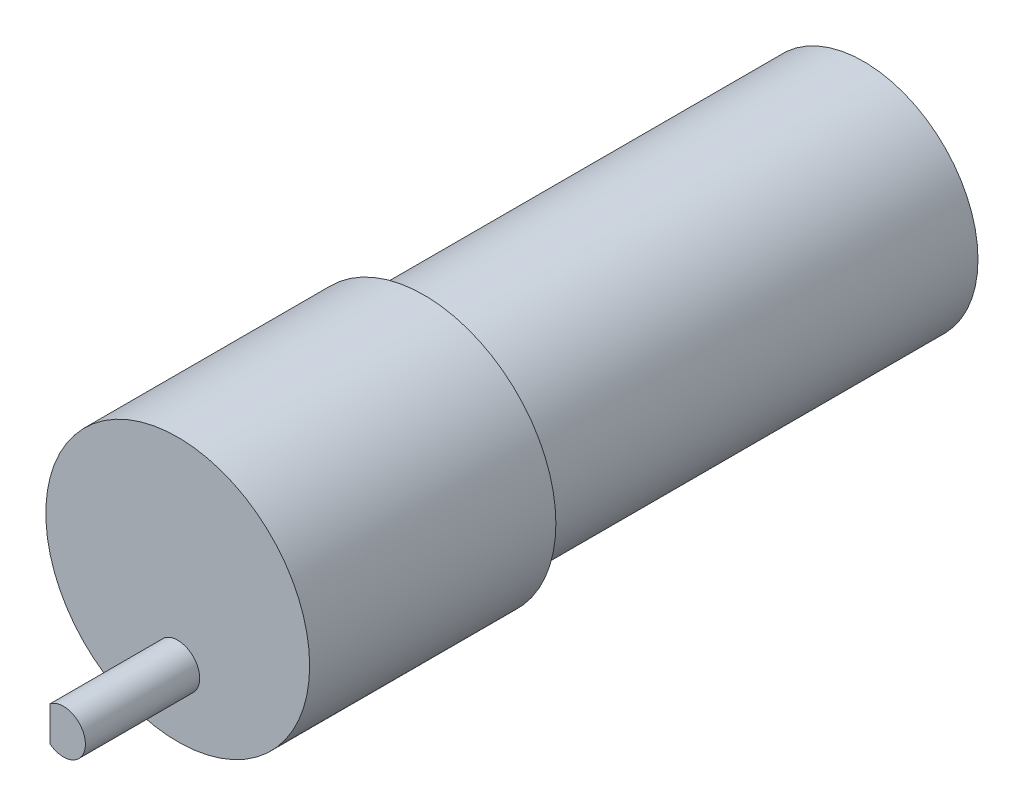
ISO-10303-21;
HEADER;
FILE_DESCRIPTION(('STEP AP214'),'2;1');
FILE_NAME('part.step','',(''),(''),'','','');
FILE_SCHEMA(('AUTOMOTIVE_DESIGN { 1 0 10303 214 1 1 1 1 }'));
ENDSEC;
DATA;
#1=APPLICATION_CONTEXT('core data for automotive mechanical design processes');
#2=APPLICATION_PROTOCOL_DEFINITION('international standard','automotive_design',2000,#1);
#3=PRODUCT_CONTEXT('',#1,'mechanical');
#4=PRODUCT('Part','Part','',(#3));
#5=PRODUCT_RELATED_PRODUCT_CATEGORY('part','',(#4));
#6=PRODUCT_DEFINITION_FORMATION('','',#4);
#7=PRODUCT_DEFINITION_CONTEXT('part definition',#1,'design');
#8=PRODUCT_DEFINITION('design','',#6,#7);
#9=PRODUCT_DEFINITION_SHAPE('','',#8);
#10=(LENGTH_UNIT() NAMED_UNIT(*) SI_UNIT(.MILLI.,.METRE.));
#11=(NAMED_UNIT(*) PLANE_ANGLE_UNIT() SI_UNIT($,.RADIAN.));
#12=(NAMED_UNIT(*) SI_UNIT($,.STERADIAN.) SOLID_ANGLE_UNIT());
#13=UNCERTAINTY_MEASURE_WITH_UNIT(LENGTH_MEASURE(1.E-05),#10,'distance_accuracy_value','');
#14=(GEOMETRIC_REPRESENTATION_CONTEXT(3) GLOBAL_UNCERTAINTY_ASSIGNED_CONTEXT((#13)) GLOBAL_UNIT_ASSIGNED_CONTEXT((#10,
#11,#12)) REPRESENTATION_CONTEXT('',''));
#15=CARTESIAN_POINT('',(0.,0.,0.));
#16=DIRECTION('',(0.,0.,1.));
#17=DIRECTION('',(1.,0.,0.));
#18=AXIS2_PLACEMENT_3D('',#15,#16,#17);
#19=CARTESIAN_POINT('',(0.,0.,78.));
#20=DIRECTION('',(0.,0.,1.));
#21=DIRECTION('',(1.,0.,0.));
#22=AXIS2_PLACEMENT_3D('',#19,#20,#21);
#23=PLANE('',#22);
#24=CARTESIAN_POINT('',(0.,-7.5,78.));
#25=DIRECTION('',(0.,0.,1.));
#26=DIRECTION('',(1.,0.,0.));
#27=AXIS2_PLACEMENT_3D('',#24,#25,#26);
#28=CIRCLE('',#27,2.5);
#29=CARTESIAN_POINT('',(-1.5,-9.5,78.));
#30=VERTEX_POINT('',#29);
#31=CARTESIAN_POINT('',(-1.5,-5.5,78.));
#32=VERTEX_POINT('',#31);
#33=EDGE_CURVE('E81',#30,#32,#28,.T.);
#34=ORIENTED_EDGE('',*,*,#33,.F.);
#35=DIRECTION('',(0.,-1.,0.));
#36=VECTOR('',#35,1.);
#37=CARTESIAN_POINT('',(-1.5,-5.5,78.));
#38=LINE('',#37,#36);
#39=EDGE_CURVE('E65',#32,#30,#38,.T.);
#40=ORIENTED_EDGE('',*,*,#39,.F.);
#41=EDGE_LOOP('',(#34,#40));
#42=FACE_BOUND('',#41,.T.);
#43=CARTESIAN_POINT('',(0.,0.,78.));
#44=DIRECTION('',(0.,0.,1.));
#45=DIRECTION('',(1.,0.,0.));
#46=AXIS2_PLACEMENT_3D('',#43,#44,#45);
#47=CIRCLE('',#46,15.);
#48=CARTESIAN_POINT('',(15.,0.,78.));
#49=VERTEX_POINT('',#48);
#50=EDGE_CURVE('E87',#49,#49,#47,.T.);
#51=ORIENTED_EDGE('',*,*,#50,.T.);
#52=EDGE_LOOP('',(#51));
#53=FACE_BOUND('',#52,.T.);
#54=ADVANCED_FACE('F44',(#42,#53),#23,.T.);
#55=CARTESIAN_POINT('',(0.,0.,50.));
#56=DIRECTION('',(0.,0.,-1.));
#57=DIRECTION('',(-1.,0.,0.));
#58=AXIS2_PLACEMENT_3D('',#55,#56,#57);
#59=CYLINDRICAL_SURFACE('',#58,13.);
#60=CARTESIAN_POINT('',(0.,0.,50.));
#61=DIRECTION('',(0.,0.,1.));
#62=DIRECTION('',(1.,0.,0.));
#63=AXIS2_PLACEMENT_3D('',#60,#61,#62);
#64=CIRCLE('',#63,13.);
#65=CARTESIAN_POINT('',(13.,0.,50.));
#66=VERTEX_POINT('',#65);
#67=EDGE_CURVE('E13',#66,#66,#64,.T.);
#68=ORIENTED_EDGE('',*,*,#67,.F.);
#69=EDGE_LOOP('',(#68));
#70=FACE_BOUND('',#69,.T.);
#71=CARTESIAN_POINT('',(0.,0.,0.));
#72=DIRECTION('',(0.,0.,1.));
#73=DIRECTION('',(1.,0.,0.));
#74=AXIS2_PLACEMENT_3D('',#71,#72,#73);
#75=CIRCLE('',#74,13.);
#76=CARTESIAN_POINT('',(13.,0.,0.));
#77=VERTEX_POINT('',#76);
#78=EDGE_CURVE('E48',#77,#77,#75,.T.);
#79=ORIENTED_EDGE('',*,*,#78,.T.);
#80=EDGE_LOOP('',(#79));
#81=FACE_BOUND('',#80,.T.);
#82=ADVANCED_FACE('F46',(#70,#81),#59,.T.);
#83=CARTESIAN_POINT('',(0.,0.,0.));
#84=DIRECTION('',(0.,0.,1.));
#85=DIRECTION('',(1.,0.,0.));
#86=AXIS2_PLACEMENT_3D('',#83,#84,#85);
#87=PLANE('',#86);
#88=ORIENTED_EDGE('',*,*,#78,.F.);
#89=EDGE_LOOP('',(#88));
#90=FACE_BOUND('',#89,.T.);
#91=ADVANCED_FACE('F99',(#90),#87,.F.);
#92=CARTESIAN_POINT('',(0.,0.,50.));
#93=DIRECTION('',(0.,0.,1.));
#94=DIRECTION('',(1.,0.,0.));
#95=AXIS2_PLACEMENT_3D('',#92,#93,#94);
#96=PLANE('',#95);
#97=CARTESIAN_POINT('',(0.,0.,50.));
#98=DIRECTION('',(0.,0.,1.));
#99=DIRECTION('',(1.,0.,0.));
#100=AXIS2_PLACEMENT_3D('',#97,#98,#99);
#101=CIRCLE('',#100,15.);
#102=CARTESIAN_POINT('',(15.,0.,50.));
#103=VERTEX_POINT('',#102);
#104=EDGE_CURVE('E84',#103,#103,#101,.T.);
#105=ORIENTED_EDGE('',*,*,#104,.F.);
#106=EDGE_LOOP('',(#105));
#107=FACE_BOUND('',#106,.T.);
#108=ORIENTED_EDGE('',*,*,#67,.T.);
#109=EDGE_LOOP('',(#108));
#110=FACE_BOUND('',#109,.T.);
#111=ADVANCED_FACE('F101',(#107,#110),#96,.F.);
#112=CARTESIAN_POINT('',(0.,0.,78.));
#113=DIRECTION('',(0.,0.,-1.));
#114=DIRECTION('',(-1.,0.,0.));
#115=AXIS2_PLACEMENT_3D('',#112,#113,#114);
#116=CYLINDRICAL_SURFACE('',#115,15.);
#117=ORIENTED_EDGE('',*,*,#50,.F.);
#118=EDGE_LOOP('',(#117));
#119=FACE_BOUND('',#118,.T.);
#120=ORIENTED_EDGE('',*,*,#104,.T.);
#121=EDGE_LOOP('',(#120));
#122=FACE_BOUND('',#121,.T.);
#123=ADVANCED_FACE('F106',(#119,#122),#116,.T.);
#124=CARTESIAN_POINT('',(0.,-7.5,91.));
#125=DIRECTION('',(0.,0.,-1.));
#126=DIRECTION('',(-1.,0.,0.));
#127=AXIS2_PLACEMENT_3D('',#124,#125,#126);
#128=CYLINDRICAL_SURFACE('',#127,2.5);
#129=ORIENTED_EDGE('',*,*,#33,.T.);
#130=DIRECTION('',(0.,0.,1.));
#131=VECTOR('',#130,1.);
#132=CARTESIAN_POINT('',(-1.5,-5.5,73.5278640450004));
#133=LINE('',#132,#131);
#134=CARTESIAN_POINT('',(-1.5,-5.5,91.));
#135=VERTEX_POINT('',#134);
#136=EDGE_CURVE('E71',#32,#135,#133,.T.);
#137=ORIENTED_EDGE('',*,*,#136,.T.);
#138=CARTESIAN_POINT('',(0.,-7.5,91.));
#139=DIRECTION('',(0.,0.,1.));
#140=DIRECTION('',(1.,0.,0.));
#141=AXIS2_PLACEMENT_3D('',#138,#139,#140);
#142=CIRCLE('',#141,2.5);
#143=CARTESIAN_POINT('',(-1.5,-9.5,91.));
#144=VERTEX_POINT('',#143);
#145=EDGE_CURVE('E79',#144,#135,#142,.T.);
#146=ORIENTED_EDGE('',*,*,#145,.F.);
#147=DIRECTION('',(0.,0.,1.));
#148=VECTOR('',#147,1.);
#149=CARTESIAN_POINT('',(-1.5,-9.5,73.5278640450004));
#150=LINE('',#149,#148);
#151=EDGE_CURVE('E59',#30,#144,#150,.T.);
#152=ORIENTED_EDGE('',*,*,#151,.F.);
#153=EDGE_LOOP('',(#129,#137,#146,#152));
#154=FACE_BOUND('',#153,.T.);
#155=ADVANCED_FACE('F78',(#154),#128,.T.);
#156=CARTESIAN_POINT('',(0.,-7.5,91.));
#157=DIRECTION('',(0.,0.,1.));
#158=DIRECTION('',(1.,0.,0.));
#159=AXIS2_PLACEMENT_3D('',#156,#157,#158);
#160=PLANE('',#159);
#161=DIRECTION('',(0.,1.,0.));
#162=VECTOR('',#161,1.);
#163=CARTESIAN_POINT('',(-1.5,-5.5,91.));
#164=LINE('',#163,#162);
#165=EDGE_CURVE('E68',#144,#135,#164,.T.);
#166=ORIENTED_EDGE('',*,*,#165,.F.);
#167=ORIENTED_EDGE('',*,*,#145,.T.);
#168=EDGE_LOOP('',(#166,#167));
#169=FACE_BOUND('',#168,.T.);
#170=ADVANCED_FACE('F83',(#169),#160,.T.);
#171=CARTESIAN_POINT('',(-1.5,-5.5,73.5278640450004));
#172=DIRECTION('',(1.,0.,0.));
#173=DIRECTION('',(0.,1.,0.));
#174=AXIS2_PLACEMENT_3D('',#171,#172,#173);
#175=PLANE('',#174);
#176=ORIENTED_EDGE('',*,*,#39,.T.);
#177=ORIENTED_EDGE('',*,*,#151,.T.);
#178=ORIENTED_EDGE('',*,*,#165,.T.);
#179=ORIENTED_EDGE('',*,*,#136,.F.);
#180=EDGE_LOOP('',(#176,#177,#178,#179));
#181=FACE_BOUND('',#180,.T.);
#182=ADVANCED_FACE('F70',(#181),#175,.F.);
#183=CLOSED_SHELL('',(#54,#82,#91,#111,#123,#155,#170,#182));
#184=MANIFOLD_SOLID_BREP('B2',#183);
#185=ADVANCED_BREP_SHAPE_REPRESENTATION('',(#18,#184),#14);
#186=SHAPE_DEFINITION_REPRESENTATION(#9,#185);
ENDSEC;
END-ISO-10303-21;
